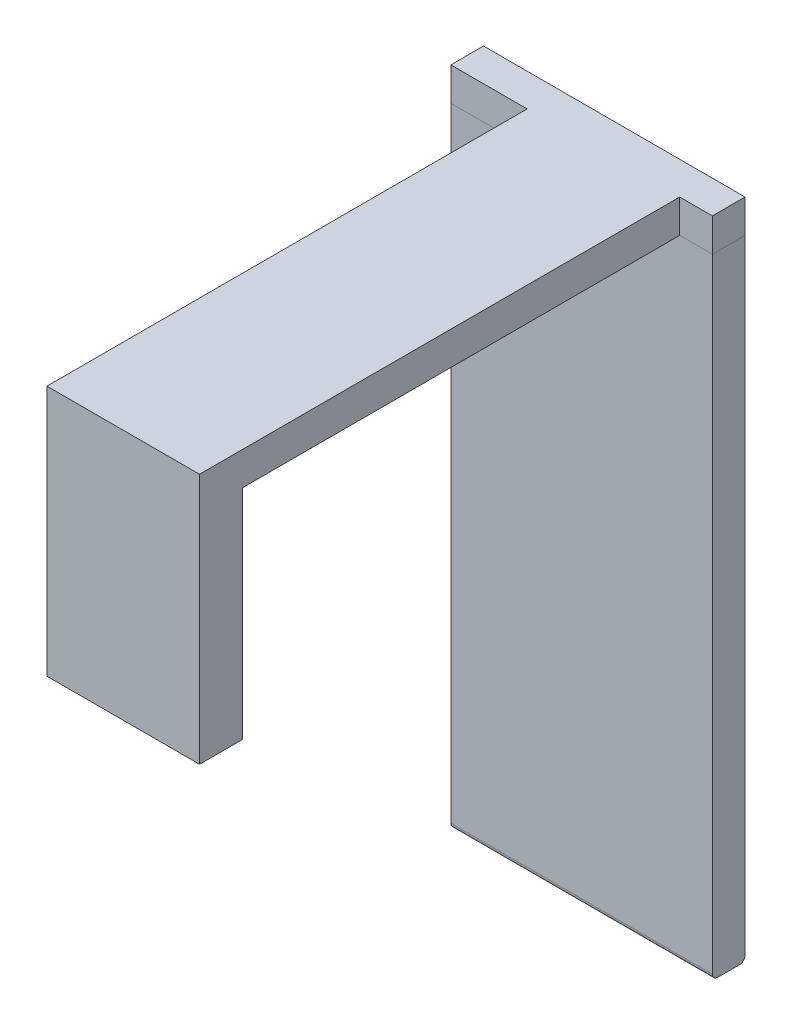
ISO-10303-21;
HEADER;
FILE_DESCRIPTION(('STEP AP214'),'2;1');
FILE_NAME('part.step','',(''),(''),'','','');
FILE_SCHEMA(('AUTOMOTIVE_DESIGN { 1 0 10303 214 1 1 1 1 }'));
ENDSEC;
DATA;
#1=APPLICATION_CONTEXT('core data for automotive mechanical design processes');
#2=APPLICATION_PROTOCOL_DEFINITION('international standard','automotive_design',2000,#1);
#3=PRODUCT_CONTEXT('',#1,'mechanical');
#4=PRODUCT('Part','Part','',(#3));
#5=PRODUCT_RELATED_PRODUCT_CATEGORY('part','',(#4));
#6=PRODUCT_DEFINITION_FORMATION('','',#4);
#7=PRODUCT_DEFINITION_CONTEXT('part definition',#1,'design');
#8=PRODUCT_DEFINITION('design','',#6,#7);
#9=PRODUCT_DEFINITION_SHAPE('','',#8);
#10=(LENGTH_UNIT() NAMED_UNIT(*) SI_UNIT(.MILLI.,.METRE.));
#11=(NAMED_UNIT(*) PLANE_ANGLE_UNIT() SI_UNIT($,.RADIAN.));
#12=(NAMED_UNIT(*) SI_UNIT($,.STERADIAN.) SOLID_ANGLE_UNIT());
#13=UNCERTAINTY_MEASURE_WITH_UNIT(LENGTH_MEASURE(1.E-05),#10,'distance_accuracy_value','');
#14=(GEOMETRIC_REPRESENTATION_CONTEXT(3) GLOBAL_UNCERTAINTY_ASSIGNED_CONTEXT((#13)) GLOBAL_UNIT_ASSIGNED_CONTEXT((#10,
#11,#12)) REPRESENTATION_CONTEXT('',''));
#15=CARTESIAN_POINT('',(0.,0.,0.));
#16=DIRECTION('',(0.,0.,1.));
#17=DIRECTION('',(1.,0.,0.));
#18=AXIS2_PLACEMENT_3D('',#15,#16,#17);
#19=CARTESIAN_POINT('',(0.,57.7,0.));
#20=DIRECTION('',(0.,0.,-1.));
#21=DIRECTION('',(-1.,0.,0.));
#22=AXIS2_PLACEMENT_3D('',#19,#20,#21);
#23=PLANE('',#22);
#24=DIRECTION('',(0.,-1.,0.));
#25=VECTOR('',#24,1.);
#26=CARTESIAN_POINT('',(0.,57.7,0.));
#27=LINE('',#26,#25);
#28=CARTESIAN_POINT('',(0.,60.7480499074707,0.));
#29=VERTEX_POINT('',#28);
#30=CARTESIAN_POINT('',(0.,57.7,0.));
#31=VERTEX_POINT('',#30);
#32=EDGE_CURVE('E176',#29,#31,#27,.T.);
#33=ORIENTED_EDGE('',*,*,#32,.F.);
#34=DIRECTION('',(-1.,0.,0.));
#35=VECTOR('',#34,1.);
#36=CARTESIAN_POINT('',(0.,60.7480499074707,0.));
#37=LINE('',#36,#35);
#38=CARTESIAN_POINT('',(24.,60.7480499074707,0.));
#39=VERTEX_POINT('',#38);
#40=EDGE_CURVE('E182',#39,#29,#37,.T.);
#41=ORIENTED_EDGE('',*,*,#40,.F.);
#42=DIRECTION('',(0.,1.,0.));
#43=VECTOR('',#42,1.);
#44=CARTESIAN_POINT('',(24.,57.7,0.));
#45=LINE('',#44,#43);
#46=CARTESIAN_POINT('',(24.,57.7,0.));
#47=VERTEX_POINT('',#46);
#48=EDGE_CURVE('E187',#47,#39,#45,.T.);
#49=ORIENTED_EDGE('',*,*,#48,.F.);
#50=DIRECTION('',(1.,0.,0.));
#51=VECTOR('',#50,1.);
#52=CARTESIAN_POINT('',(0.,57.7,0.));
#53=LINE('',#52,#51);
#54=EDGE_CURVE('E165',#31,#47,#53,.T.);
#55=ORIENTED_EDGE('',*,*,#54,.F.);
#56=EDGE_LOOP('',(#33,#41,#49,#55));
#57=FACE_BOUND('',#56,.T.);
#58=ADVANCED_FACE('F57',(#57),#23,.T.);
#59=CARTESIAN_POINT('',(0.,57.7,-24.1927800849434));
#60=DIRECTION('',(0.,-1.,0.));
#61=DIRECTION('',(0.,0.,-1.));
#62=AXIS2_PLACEMENT_3D('',#59,#60,#61);
#63=PLANE('',#62);
#64=DIRECTION('',(1.,0.,0.));
#65=VECTOR('',#64,1.);
#66=CARTESIAN_POINT('',(0.,57.7,2.99999999999998));
#67=LINE('',#66,#65);
#68=CARTESIAN_POINT('',(21.,57.7,3.));
#69=VERTEX_POINT('',#68);
#70=CARTESIAN_POINT('',(24.,57.7,3.));
#71=VERTEX_POINT('',#70);
#72=EDGE_CURVE('E141',#69,#71,#67,.T.);
#73=ORIENTED_EDGE('',*,*,#72,.F.);
#74=DIRECTION('',(0.,0.,-1.));
#75=VECTOR('',#74,1.);
#76=CARTESIAN_POINT('',(21.,57.7,-24.1927800849434));
#77=LINE('',#76,#75);
#78=CARTESIAN_POINT('',(21.,57.7,43.1));
#79=VERTEX_POINT('',#78);
#80=EDGE_CURVE('E142',#79,#69,#77,.T.);
#81=ORIENTED_EDGE('',*,*,#80,.F.);
#82=DIRECTION('',(1.,0.,0.));
#83=VECTOR('',#82,1.);
#84=CARTESIAN_POINT('',(0.,57.7,43.1));
#85=LINE('',#84,#83);
#86=CARTESIAN_POINT('',(7.,57.7,43.1));
#87=VERTEX_POINT('',#86);
#88=EDGE_CURVE('E159',#87,#79,#85,.T.);
#89=ORIENTED_EDGE('',*,*,#88,.F.);
#90=DIRECTION('',(0.,0.,1.));
#91=VECTOR('',#90,1.);
#92=CARTESIAN_POINT('',(7.00000000000001,57.7,-24.1927800849434));
#93=LINE('',#92,#91);
#94=CARTESIAN_POINT('',(7.00000000000001,57.7,3.));
#95=VERTEX_POINT('',#94);
#96=EDGE_CURVE('E221',#95,#87,#93,.T.);
#97=ORIENTED_EDGE('',*,*,#96,.F.);
#98=DIRECTION('',(1.,0.,0.));
#99=VECTOR('',#98,1.);
#100=CARTESIAN_POINT('',(0.,57.7,3.));
#101=LINE('',#100,#99);
#102=CARTESIAN_POINT('',(0.,57.7,3.));
#103=VERTEX_POINT('',#102);
#104=EDGE_CURVE('E212',#103,#95,#101,.T.);
#105=ORIENTED_EDGE('',*,*,#104,.F.);
#106=DIRECTION('',(0.,0.,1.));
#107=VECTOR('',#106,1.);
#108=CARTESIAN_POINT('',(0.,57.7,-24.1927800849434));
#109=LINE('',#108,#107);
#110=EDGE_CURVE('E180',#31,#103,#109,.T.);
#111=ORIENTED_EDGE('',*,*,#110,.F.);
#112=ORIENTED_EDGE('',*,*,#54,.T.);
#113=DIRECTION('',(0.,0.,1.));
#114=VECTOR('',#113,1.);
#115=CARTESIAN_POINT('',(24.,57.7,-24.1927800849434));
#116=LINE('',#115,#114);
#117=EDGE_CURVE('E175',#47,#71,#116,.T.);
#118=ORIENTED_EDGE('',*,*,#117,.T.);
#119=EDGE_LOOP('',(#73,#81,#89,#97,#105,#111,#112,#118));
#120=FACE_BOUND('',#119,.T.);
#121=ADVANCED_FACE('F251',(#120),#63,.T.);
#122=CARTESIAN_POINT('',(24.,57.7,-24.1927800849434));
#123=DIRECTION('',(1.,0.,0.));
#124=DIRECTION('',(0.,0.,-1.));
#125=AXIS2_PLACEMENT_3D('',#122,#123,#124);
#126=PLANE('',#125);
#127=DIRECTION('',(0.,-1.,0.));
#128=VECTOR('',#127,1.);
#129=CARTESIAN_POINT('',(24.,88.7,3.));
#130=LINE('',#129,#128);
#131=CARTESIAN_POINT('',(24.,60.7480499074707,3.));
#132=VERTEX_POINT('',#131);
#133=EDGE_CURVE('E240',#132,#71,#130,.T.);
#134=ORIENTED_EDGE('',*,*,#133,.T.);
#135=ORIENTED_EDGE('',*,*,#117,.F.);
#136=ORIENTED_EDGE('',*,*,#48,.T.);
#137=DIRECTION('',(0.,0.,1.));
#138=VECTOR('',#137,1.);
#139=CARTESIAN_POINT('',(24.,60.7480499074707,-24.1927800849434));
#140=LINE('',#139,#138);
#141=EDGE_CURVE('E186',#39,#132,#140,.T.);
#142=ORIENTED_EDGE('',*,*,#141,.T.);
#143=EDGE_LOOP('',(#134,#135,#136,#142));
#144=FACE_BOUND('',#143,.T.);
#145=ADVANCED_FACE('F257',(#144),#126,.T.);
#146=CARTESIAN_POINT('',(0.,60.7480499074707,-24.1927800849434));
#147=DIRECTION('',(0.,1.,0.));
#148=DIRECTION('',(0.,0.,1.));
#149=AXIS2_PLACEMENT_3D('',#146,#147,#148);
#150=PLANE('',#149);
#151=DIRECTION('',(-1.,0.,0.));
#152=VECTOR('',#151,1.);
#153=CARTESIAN_POINT('',(0.,60.7480499074707,2.99999999999998));
#154=LINE('',#153,#152);
#155=CARTESIAN_POINT('',(21.,60.7480499074707,3.));
#156=VERTEX_POINT('',#155);
#157=EDGE_CURVE('E12',#132,#156,#154,.T.);
#158=ORIENTED_EDGE('',*,*,#157,.F.);
#159=ORIENTED_EDGE('',*,*,#141,.F.);
#160=ORIENTED_EDGE('',*,*,#40,.T.);
#161=DIRECTION('',(0.,0.,1.));
#162=VECTOR('',#161,1.);
#163=CARTESIAN_POINT('',(0.,60.7480499074707,-24.1927800849434));
#164=LINE('',#163,#162);
#165=CARTESIAN_POINT('',(0.,60.7480499074707,3.));
#166=VERTEX_POINT('',#165);
#167=EDGE_CURVE('E181',#29,#166,#164,.T.);
#168=ORIENTED_EDGE('',*,*,#167,.T.);
#169=DIRECTION('',(-1.,0.,0.));
#170=VECTOR('',#169,1.);
#171=CARTESIAN_POINT('',(0.,60.7480499074707,3.));
#172=LINE('',#171,#170);
#173=CARTESIAN_POINT('',(7.00000000000001,60.7480499074707,3.));
#174=VERTEX_POINT('',#173);
#175=EDGE_CURVE('E214',#174,#166,#172,.T.);
#176=ORIENTED_EDGE('',*,*,#175,.F.);
#177=DIRECTION('',(0.,0.,-1.));
#178=VECTOR('',#177,1.);
#179=CARTESIAN_POINT('',(7.00000000000001,60.7480499074707,-24.1927800849434));
#180=LINE('',#179,#178);
#181=CARTESIAN_POINT('',(7.,60.7480499074707,47.0573098107076));
#182=VERTEX_POINT('',#181);
#183=EDGE_CURVE('E157',#182,#174,#180,.T.);
#184=ORIENTED_EDGE('',*,*,#183,.F.);
#185=DIRECTION('',(-1.,0.,0.));
#186=VECTOR('',#185,1.);
#187=CARTESIAN_POINT('',(0.,60.7480499074707,47.0573098107076));
#188=LINE('',#187,#186);
#189=CARTESIAN_POINT('',(21.,60.7480499074707,47.0573098107076));
#190=VERTEX_POINT('',#189);
#191=EDGE_CURVE('E148',#190,#182,#188,.T.);
#192=ORIENTED_EDGE('',*,*,#191,.F.);
#193=DIRECTION('',(0.,0.,1.));
#194=VECTOR('',#193,1.);
#195=CARTESIAN_POINT('',(21.,60.7480499074707,-24.1927800849434));
#196=LINE('',#195,#194);
#197=EDGE_CURVE('E133',#156,#190,#196,.T.);
#198=ORIENTED_EDGE('',*,*,#197,.F.);
#199=EDGE_LOOP('',(#158,#159,#160,#168,#176,#184,#192,#198));
#200=FACE_BOUND('',#199,.T.);
#201=ADVANCED_FACE('F155',(#200),#150,.T.);
#202=CARTESIAN_POINT('',(0.,57.7,-24.1927800849434));
#203=DIRECTION('',(-1.,0.,0.));
#204=DIRECTION('',(0.,0.,1.));
#205=AXIS2_PLACEMENT_3D('',#202,#203,#204);
#206=PLANE('',#205);
#207=DIRECTION('',(0.,-1.,0.));
#208=VECTOR('',#207,1.);
#209=CARTESIAN_POINT('',(0.,88.7,3.));
#210=LINE('',#209,#208);
#211=EDGE_CURVE('E227',#166,#103,#210,.T.);
#212=ORIENTED_EDGE('',*,*,#211,.F.);
#213=ORIENTED_EDGE('',*,*,#167,.F.);
#214=ORIENTED_EDGE('',*,*,#32,.T.);
#215=ORIENTED_EDGE('',*,*,#110,.T.);
#216=EDGE_LOOP('',(#212,#213,#214,#215));
#217=FACE_BOUND('',#216,.T.);
#218=ADVANCED_FACE('F264',(#217),#206,.T.);
#219=CARTESIAN_POINT('',(0.,85.0721182542322,43.1));
#220=DIRECTION('',(0.,0.,-1.));
#221=DIRECTION('',(-1.,0.,0.));
#222=AXIS2_PLACEMENT_3D('',#219,#220,#221);
#223=PLANE('',#222);
#224=DIRECTION('',(0.,1.,0.));
#225=VECTOR('',#224,1.);
#226=CARTESIAN_POINT('',(21.,85.0721182542322,43.1));
#227=LINE('',#226,#225);
#228=CARTESIAN_POINT('',(21.,37.7,43.1));
#229=VERTEX_POINT('',#228);
#230=EDGE_CURVE('E211',#229,#79,#227,.T.);
#231=ORIENTED_EDGE('',*,*,#230,.F.);
#232=DIRECTION('',(1.,0.,0.));
#233=VECTOR('',#232,1.);
#234=CARTESIAN_POINT('',(0.,37.7,43.1));
#235=LINE('',#234,#233);
#236=CARTESIAN_POINT('',(7.,37.7,43.1));
#237=VERTEX_POINT('',#236);
#238=EDGE_CURVE('E168',#237,#229,#235,.T.);
#239=ORIENTED_EDGE('',*,*,#238,.F.);
#240=DIRECTION('',(0.,-1.,0.));
#241=VECTOR('',#240,1.);
#242=CARTESIAN_POINT('',(7.,85.0721182542322,43.1));
#243=LINE('',#242,#241);
#244=EDGE_CURVE('E80',#87,#237,#243,.T.);
#245=ORIENTED_EDGE('',*,*,#244,.F.);
#246=ORIENTED_EDGE('',*,*,#88,.T.);
#247=EDGE_LOOP('',(#231,#239,#245,#246));
#248=FACE_BOUND('',#247,.T.);
#249=ADVANCED_FACE('F209',(#248),#223,.T.);
#250=CARTESIAN_POINT('',(0.,85.0721182542322,47.0573098107076));
#251=DIRECTION('',(0.,0.,1.));
#252=DIRECTION('',(1.,0.,0.));
#253=AXIS2_PLACEMENT_3D('',#250,#251,#252);
#254=PLANE('',#253);
#255=DIRECTION('',(0.,-1.,0.));
#256=VECTOR('',#255,1.);
#257=CARTESIAN_POINT('',(21.,88.7,47.0573098107076));
#258=LINE('',#257,#256);
#259=CARTESIAN_POINT('',(21.,37.7,47.0573098107076));
#260=VERTEX_POINT('',#259);
#261=EDGE_CURVE('E72',#190,#260,#258,.T.);
#262=ORIENTED_EDGE('',*,*,#261,.F.);
#263=ORIENTED_EDGE('',*,*,#191,.T.);
#264=DIRECTION('',(0.,-1.,0.));
#265=VECTOR('',#264,1.);
#266=CARTESIAN_POINT('',(7.,88.7,47.0573098107076));
#267=LINE('',#266,#265);
#268=CARTESIAN_POINT('',(7.,37.7,47.0573098107076));
#269=VERTEX_POINT('',#268);
#270=EDGE_CURVE('E226',#182,#269,#267,.T.);
#271=ORIENTED_EDGE('',*,*,#270,.T.);
#272=DIRECTION('',(-1.,0.,0.));
#273=VECTOR('',#272,1.);
#274=CARTESIAN_POINT('',(0.,37.7,47.0573098107076));
#275=LINE('',#274,#273);
#276=EDGE_CURVE('E150',#260,#269,#275,.T.);
#277=ORIENTED_EDGE('',*,*,#276,.F.);
#278=EDGE_LOOP('',(#262,#263,#271,#277));
#279=FACE_BOUND('',#278,.T.);
#280=ADVANCED_FACE('F146',(#279),#254,.T.);
#281=CARTESIAN_POINT('',(0.,37.7,0.));
#282=DIRECTION('',(0.,1.,0.));
#283=DIRECTION('',(0.,0.,1.));
#284=AXIS2_PLACEMENT_3D('',#281,#282,#283);
#285=PLANE('',#284);
#286=ORIENTED_EDGE('',*,*,#238,.T.);
#287=DIRECTION('',(0.,0.,-1.));
#288=VECTOR('',#287,1.);
#289=CARTESIAN_POINT('',(21.,37.7,47.0573098107076));
#290=LINE('',#289,#288);
#291=EDGE_CURVE('E152',#260,#229,#290,.T.);
#292=ORIENTED_EDGE('',*,*,#291,.F.);
#293=ORIENTED_EDGE('',*,*,#276,.T.);
#294=DIRECTION('',(0.,0.,-1.));
#295=VECTOR('',#294,1.);
#296=CARTESIAN_POINT('',(7.00000000000001,37.7,0.));
#297=LINE('',#296,#295);
#298=EDGE_CURVE('E65',#269,#237,#297,.T.);
#299=ORIENTED_EDGE('',*,*,#298,.T.);
#300=EDGE_LOOP('',(#286,#292,#293,#299));
#301=FACE_BOUND('',#300,.T.);
#302=ADVANCED_FACE('F206',(#301),#285,.F.);
#303=CARTESIAN_POINT('',(7.,88.7,47.0573098107076));
#304=DIRECTION('',(1.,0.,0.));
#305=DIRECTION('',(0.,0.,-1.));
#306=AXIS2_PLACEMENT_3D('',#303,#304,#305);
#307=PLANE('',#306);
#308=ORIENTED_EDGE('',*,*,#183,.T.);
#309=DIRECTION('',(0.,-1.,0.));
#310=VECTOR('',#309,1.);
#311=CARTESIAN_POINT('',(7.00000000000001,88.7,3.));
#312=LINE('',#311,#310);
#313=EDGE_CURVE('E230',#174,#95,#312,.T.);
#314=ORIENTED_EDGE('',*,*,#313,.T.);
#315=ORIENTED_EDGE('',*,*,#96,.T.);
#316=ORIENTED_EDGE('',*,*,#244,.T.);
#317=ORIENTED_EDGE('',*,*,#298,.F.);
#318=ORIENTED_EDGE('',*,*,#270,.F.);
#319=EDGE_LOOP('',(#308,#314,#315,#316,#317,#318));
#320=FACE_BOUND('',#319,.T.);
#321=ADVANCED_FACE('F269',(#320),#307,.F.);
#322=CARTESIAN_POINT('',(0.,88.7,3.));
#323=DIRECTION('',(0.,0.,-1.));
#324=DIRECTION('',(-1.,0.,0.));
#325=AXIS2_PLACEMENT_3D('',#322,#323,#324);
#326=PLANE('',#325);
#327=ORIENTED_EDGE('',*,*,#104,.T.);
#328=ORIENTED_EDGE('',*,*,#313,.F.);
#329=ORIENTED_EDGE('',*,*,#175,.T.);
#330=ORIENTED_EDGE('',*,*,#211,.T.);
#331=EDGE_LOOP('',(#327,#328,#329,#330));
#332=FACE_BOUND('',#331,.T.);
#333=ADVANCED_FACE('F267',(#332),#326,.F.);
#334=CARTESIAN_POINT('',(24.,88.7,3.));
#335=DIRECTION('',(0.,0.,-1.));
#336=DIRECTION('',(-1.,0.,0.));
#337=AXIS2_PLACEMENT_3D('',#334,#335,#336);
#338=PLANE('',#337);
#339=ORIENTED_EDGE('',*,*,#72,.T.);
#340=ORIENTED_EDGE('',*,*,#133,.F.);
#341=ORIENTED_EDGE('',*,*,#157,.T.);
#342=DIRECTION('',(0.,-1.,0.));
#343=VECTOR('',#342,1.);
#344=CARTESIAN_POINT('',(21.,88.7,3.));
#345=LINE('',#344,#343);
#346=EDGE_CURVE('E136',#156,#69,#345,.T.);
#347=ORIENTED_EDGE('',*,*,#346,.T.);
#348=EDGE_LOOP('',(#339,#340,#341,#347));
#349=FACE_BOUND('',#348,.T.);
#350=ADVANCED_FACE('F255',(#349),#338,.F.);
#351=CARTESIAN_POINT('',(21.,88.7,47.0573098107076));
#352=DIRECTION('',(-1.,0.,0.));
#353=DIRECTION('',(0.,0.,1.));
#354=AXIS2_PLACEMENT_3D('',#351,#352,#353);
#355=PLANE('',#354);
#356=ORIENTED_EDGE('',*,*,#197,.T.);
#357=ORIENTED_EDGE('',*,*,#261,.T.);
#358=ORIENTED_EDGE('',*,*,#291,.T.);
#359=ORIENTED_EDGE('',*,*,#230,.T.);
#360=ORIENTED_EDGE('',*,*,#80,.T.);
#361=ORIENTED_EDGE('',*,*,#346,.F.);
#362=EDGE_LOOP('',(#356,#357,#358,#359,#360,#361));
#363=FACE_BOUND('',#362,.T.);
#364=ADVANCED_FACE('F134',(#363),#355,.F.);
#365=CLOSED_SHELL('',(#58,#121,#145,#201,#218,#249,#280,#302,#321,#333,#350,#364));
#366=MANIFOLD_SOLID_BREP('B2',#365);
#367=CARTESIAN_POINT('',(24.,57.7,0.));
#368=DIRECTION('',(1.,0.,0.));
#369=DIRECTION('',(0.,0.,-1.));
#370=AXIS2_PLACEMENT_3D('',#367,#368,#369);
#371=PLANE('',#370);
#372=DIRECTION('',(0.,0.,1.));
#373=VECTOR('',#372,1.);
#374=CARTESIAN_POINT('',(24.,0.,0.));
#375=LINE('',#374,#373);
#376=CARTESIAN_POINT('',(24.,0.,0.5));
#377=VERTEX_POINT('',#376);
#378=CARTESIAN_POINT('',(24.,0.,2.5));
#379=VERTEX_POINT('',#378);
#380=EDGE_CURVE('E478',#377,#379,#375,.T.);
#381=ORIENTED_EDGE('',*,*,#380,.F.);
#382=CARTESIAN_POINT('',(24.,0.5,0.5));
#383=DIRECTION('',(1.,0.,0.));
#384=DIRECTION('',(0.,0.,-1.));
#385=AXIS2_PLACEMENT_3D('',#382,#383,#384);
#386=CIRCLE('',#385,0.5);
#387=CARTESIAN_POINT('',(24.,0.5,0.));
#388=VERTEX_POINT('',#387);
#389=EDGE_CURVE('E449',#377,#388,#386,.T.);
#390=ORIENTED_EDGE('',*,*,#389,.T.);
#391=DIRECTION('',(0.,-1.,0.));
#392=VECTOR('',#391,1.);
#393=CARTESIAN_POINT('',(24.,57.7,0.));
#394=LINE('',#393,#392);
#395=CARTESIAN_POINT('',(24.,57.7,0.));
#396=VERTEX_POINT('',#395);
#397=EDGE_CURVE('E444',#396,#388,#394,.T.);
#398=ORIENTED_EDGE('',*,*,#397,.F.);
#399=DIRECTION('',(0.,0.,1.));
#400=VECTOR('',#399,1.);
#401=CARTESIAN_POINT('',(24.,57.7,0.));
#402=LINE('',#401,#400);
#403=CARTESIAN_POINT('',(24.,57.7,3.));
#404=VERTEX_POINT('',#403);
#405=EDGE_CURVE('E448',#396,#404,#402,.T.);
#406=ORIENTED_EDGE('',*,*,#405,.T.);
#407=DIRECTION('',(0.,-1.,0.));
#408=VECTOR('',#407,1.);
#409=CARTESIAN_POINT('',(24.,57.7,3.));
#410=LINE('',#409,#408);
#411=CARTESIAN_POINT('',(24.,0.5,3.));
#412=VERTEX_POINT('',#411);
#413=EDGE_CURVE('E477',#404,#412,#410,.T.);
#414=ORIENTED_EDGE('',*,*,#413,.T.);
#415=CARTESIAN_POINT('',(24.,0.5,2.5));
#416=DIRECTION('',(1.,0.,0.));
#417=DIRECTION('',(0.,0.,-1.));
#418=AXIS2_PLACEMENT_3D('',#415,#416,#417);
#419=CIRCLE('',#418,0.5);
#420=EDGE_CURVE('E497',#412,#379,#419,.T.);
#421=ORIENTED_EDGE('',*,*,#420,.T.);
#422=EDGE_LOOP('',(#381,#390,#398,#406,#414,#421));
#423=FACE_BOUND('',#422,.T.);
#424=ADVANCED_FACE('F388',(#423),#371,.T.);
#425=CARTESIAN_POINT('',(0.,57.7,0.));
#426=DIRECTION('',(0.,0.,-1.));
#427=DIRECTION('',(-1.,0.,0.));
#428=AXIS2_PLACEMENT_3D('',#425,#426,#427);
#429=PLANE('',#428);
#430=ORIENTED_EDGE('',*,*,#397,.T.);
#431=DIRECTION('',(1.,0.,0.));
#432=VECTOR('',#431,1.);
#433=CARTESIAN_POINT('',(0.,0.5,0.));
#434=LINE('',#433,#432);
#435=CARTESIAN_POINT('',(0.,0.5,0.));
#436=VERTEX_POINT('',#435);
#437=EDGE_CURVE('E412',#388,#436,#434,.F.);
#438=ORIENTED_EDGE('',*,*,#437,.T.);
#439=DIRECTION('',(0.,-1.,0.));
#440=VECTOR('',#439,1.);
#441=CARTESIAN_POINT('',(0.,57.7,0.));
#442=LINE('',#441,#440);
#443=CARTESIAN_POINT('',(0.,57.7,0.));
#444=VERTEX_POINT('',#443);
#445=EDGE_CURVE('E453',#444,#436,#442,.T.);
#446=ORIENTED_EDGE('',*,*,#445,.F.);
#447=DIRECTION('',(1.,0.,0.));
#448=VECTOR('',#447,1.);
#449=CARTESIAN_POINT('',(0.,57.7,0.));
#450=LINE('',#449,#448);
#451=EDGE_CURVE('E458',#444,#396,#450,.T.);
#452=ORIENTED_EDGE('',*,*,#451,.T.);
#453=EDGE_LOOP('',(#430,#438,#446,#452));
#454=FACE_BOUND('',#453,.T.);
#455=ADVANCED_FACE('F465',(#454),#429,.T.);
#456=CARTESIAN_POINT('',(0.,57.7,0.));
#457=DIRECTION('',(1.,0.,0.));
#458=DIRECTION('',(0.,0.,-1.));
#459=AXIS2_PLACEMENT_3D('',#456,#457,#458);
#460=PLANE('',#459);
#461=ORIENTED_EDGE('',*,*,#445,.T.);
#462=CARTESIAN_POINT('',(0.,0.5,0.5));
#463=DIRECTION('',(1.,0.,0.));
#464=DIRECTION('',(0.,0.,-1.));
#465=AXIS2_PLACEMENT_3D('',#462,#463,#464);
#466=CIRCLE('',#465,0.5);
#467=CARTESIAN_POINT('',(0.,0.,0.5));
#468=VERTEX_POINT('',#467);
#469=EDGE_CURVE('E397',#436,#468,#466,.F.);
#470=ORIENTED_EDGE('',*,*,#469,.T.);
#471=DIRECTION('',(0.,0.,1.));
#472=VECTOR('',#471,1.);
#473=CARTESIAN_POINT('',(0.,0.,0.));
#474=LINE('',#473,#472);
#475=CARTESIAN_POINT('',(0.,0.,2.5));
#476=VERTEX_POINT('',#475);
#477=EDGE_CURVE('E463',#468,#476,#474,.T.);
#478=ORIENTED_EDGE('',*,*,#477,.T.);
#479=CARTESIAN_POINT('',(0.,0.5,2.5));
#480=DIRECTION('',(1.,0.,0.));
#481=DIRECTION('',(0.,0.,-1.));
#482=AXIS2_PLACEMENT_3D('',#479,#480,#481);
#483=CIRCLE('',#482,0.5);
#484=CARTESIAN_POINT('',(0.,0.5,3.));
#485=VERTEX_POINT('',#484);
#486=EDGE_CURVE('E404',#476,#485,#483,.F.);
#487=ORIENTED_EDGE('',*,*,#486,.T.);
#488=DIRECTION('',(0.,-1.,0.));
#489=VECTOR('',#488,1.);
#490=CARTESIAN_POINT('',(0.,57.7,3.));
#491=LINE('',#490,#489);
#492=CARTESIAN_POINT('',(0.,57.7,3.));
#493=VERTEX_POINT('',#492);
#494=EDGE_CURVE('E486',#493,#485,#491,.T.);
#495=ORIENTED_EDGE('',*,*,#494,.F.);
#496=DIRECTION('',(0.,0.,1.));
#497=VECTOR('',#496,1.);
#498=CARTESIAN_POINT('',(0.,57.7,0.));
#499=LINE('',#498,#497);
#500=EDGE_CURVE('E468',#444,#493,#499,.T.);
#501=ORIENTED_EDGE('',*,*,#500,.F.);
#502=EDGE_LOOP('',(#461,#470,#478,#487,#495,#501));
#503=FACE_BOUND('',#502,.T.);
#504=ADVANCED_FACE('F506',(#503),#460,.F.);
#505=CARTESIAN_POINT('',(0.,57.7,3.));
#506=DIRECTION('',(0.,0.,-1.));
#507=DIRECTION('',(-1.,0.,0.));
#508=AXIS2_PLACEMENT_3D('',#505,#506,#507);
#509=PLANE('',#508);
#510=ORIENTED_EDGE('',*,*,#494,.T.);
#511=DIRECTION('',(1.,0.,0.));
#512=VECTOR('',#511,1.);
#513=CARTESIAN_POINT('',(0.,0.5,3.));
#514=LINE('',#513,#512);
#515=EDGE_CURVE('E55',#485,#412,#514,.T.);
#516=ORIENTED_EDGE('',*,*,#515,.T.);
#517=ORIENTED_EDGE('',*,*,#413,.F.);
#518=DIRECTION('',(1.,0.,0.));
#519=VECTOR('',#518,1.);
#520=CARTESIAN_POINT('',(0.,57.7,3.));
#521=LINE('',#520,#519);
#522=EDGE_CURVE('E460',#493,#404,#521,.T.);
#523=ORIENTED_EDGE('',*,*,#522,.F.);
#524=EDGE_LOOP('',(#510,#516,#517,#523));
#525=FACE_BOUND('',#524,.T.);
#526=ADVANCED_FACE('F527',(#525),#509,.F.);
#527=CARTESIAN_POINT('',(0.,57.7,0.));
#528=DIRECTION('',(0.,1.,0.));
#529=DIRECTION('',(0.,0.,1.));
#530=AXIS2_PLACEMENT_3D('',#527,#528,#529);
#531=PLANE('',#530);
#532=ORIENTED_EDGE('',*,*,#405,.F.);
#533=ORIENTED_EDGE('',*,*,#451,.F.);
#534=ORIENTED_EDGE('',*,*,#500,.T.);
#535=ORIENTED_EDGE('',*,*,#522,.T.);
#536=EDGE_LOOP('',(#532,#533,#534,#535));
#537=FACE_BOUND('',#536,.T.);
#538=ADVANCED_FACE('F457',(#537),#531,.T.);
#539=CARTESIAN_POINT('',(0.,0.,0.));
#540=DIRECTION('',(0.,1.,0.));
#541=DIRECTION('',(0.,0.,1.));
#542=AXIS2_PLACEMENT_3D('',#539,#540,#541);
#543=PLANE('',#542);
#544=ORIENTED_EDGE('',*,*,#477,.F.);
#545=DIRECTION('',(1.,0.,0.));
#546=VECTOR('',#545,1.);
#547=CARTESIAN_POINT('',(24.,0.,0.5));
#548=LINE('',#547,#546);
#549=EDGE_CURVE('E493',#468,#377,#548,.T.);
#550=ORIENTED_EDGE('',*,*,#549,.T.);
#551=ORIENTED_EDGE('',*,*,#380,.T.);
#552=DIRECTION('',(1.,0.,0.));
#553=VECTOR('',#552,1.);
#554=CARTESIAN_POINT('',(0.,0.,2.5));
#555=LINE('',#554,#553);
#556=EDGE_CURVE('E452',#379,#476,#555,.F.);
#557=ORIENTED_EDGE('',*,*,#556,.T.);
#558=EDGE_LOOP('',(#544,#550,#551,#557));
#559=FACE_BOUND('',#558,.T.);
#560=ADVANCED_FACE('F510',(#559),#543,.F.);
#561=CARTESIAN_POINT('',(0.,0.5,0.5));
#562=DIRECTION('',(-1.,0.,0.));
#563=DIRECTION('',(0.,0.,1.));
#564=AXIS2_PLACEMENT_3D('',#561,#562,#563);
#565=CYLINDRICAL_SURFACE('',#564,0.5);
#566=ORIENTED_EDGE('',*,*,#469,.F.);
#567=ORIENTED_EDGE('',*,*,#437,.F.);
#568=ORIENTED_EDGE('',*,*,#389,.F.);
#569=ORIENTED_EDGE('',*,*,#549,.F.);
#570=EDGE_LOOP('',(#566,#567,#568,#569));
#571=FACE_BOUND('',#570,.T.);
#572=ADVANCED_FACE('F512',(#571),#565,.T.);
#573=CARTESIAN_POINT('',(0.,0.5,2.5));
#574=DIRECTION('',(1.,0.,0.));
#575=DIRECTION('',(0.,0.,-1.));
#576=AXIS2_PLACEMENT_3D('',#573,#574,#575);
#577=CYLINDRICAL_SURFACE('',#576,0.5);
#578=ORIENTED_EDGE('',*,*,#486,.F.);
#579=ORIENTED_EDGE('',*,*,#556,.F.);
#580=ORIENTED_EDGE('',*,*,#420,.F.);
#581=ORIENTED_EDGE('',*,*,#515,.F.);
#582=EDGE_LOOP('',(#578,#579,#580,#581));
#583=FACE_BOUND('',#582,.T.);
#584=ADVANCED_FACE('F390',(#583),#577,.T.);
#585=CLOSED_SHELL('',(#424,#455,#504,#526,#538,#560,#572,#584));
#586=MANIFOLD_SOLID_BREP('B6',#585);
#587=ADVANCED_BREP_SHAPE_REPRESENTATION('',(#18,#366,#586),#14);
#588=SHAPE_DEFINITION_REPRESENTATION(#9,#587);
ENDSEC;
END-ISO-10303-21;
